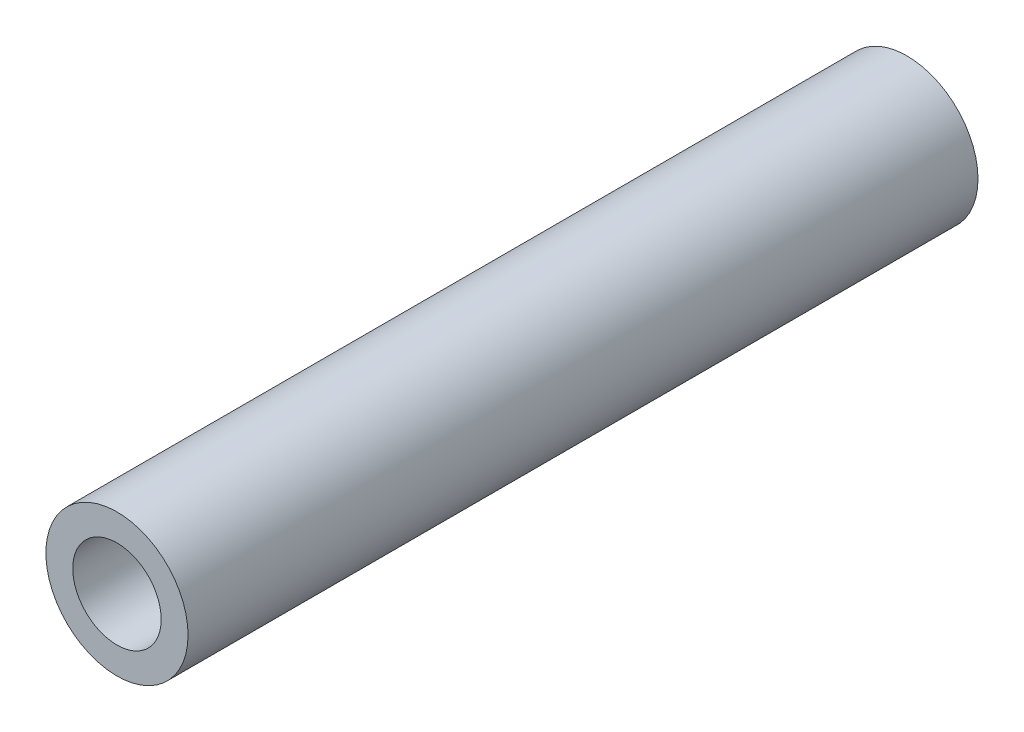
ISO-10303-21;
HEADER;
FILE_DESCRIPTION(('STEP AP214'),'2;1');
FILE_NAME('part.step','',(''),(''),'','','');
FILE_SCHEMA(('AUTOMOTIVE_DESIGN { 1 0 10303 214 1 1 1 1 }'));
ENDSEC;
DATA;
#1=APPLICATION_CONTEXT('core data for automotive mechanical design processes');
#2=APPLICATION_PROTOCOL_DEFINITION('international standard','automotive_design',2000,#1);
#3=PRODUCT_CONTEXT('',#1,'mechanical');
#4=PRODUCT('Part','Part','',(#3));
#5=PRODUCT_RELATED_PRODUCT_CATEGORY('part','',(#4));
#6=PRODUCT_DEFINITION_FORMATION('','',#4);
#7=PRODUCT_DEFINITION_CONTEXT('part definition',#1,'design');
#8=PRODUCT_DEFINITION('design','',#6,#7);
#9=PRODUCT_DEFINITION_SHAPE('','',#8);
#10=(LENGTH_UNIT() NAMED_UNIT(*) SI_UNIT(.MILLI.,.METRE.));
#11=(NAMED_UNIT(*) PLANE_ANGLE_UNIT() SI_UNIT($,.RADIAN.));
#12=(NAMED_UNIT(*) SI_UNIT($,.STERADIAN.) SOLID_ANGLE_UNIT());
#13=UNCERTAINTY_MEASURE_WITH_UNIT(LENGTH_MEASURE(1.E-05),#10,'distance_accuracy_value','');
#14=(GEOMETRIC_REPRESENTATION_CONTEXT(3) GLOBAL_UNCERTAINTY_ASSIGNED_CONTEXT((#13)) GLOBAL_UNIT_ASSIGNED_CONTEXT((#10,
#11,#12)) REPRESENTATION_CONTEXT('',''));
#15=CARTESIAN_POINT('',(0.,0.,0.));
#16=DIRECTION('',(0.,0.,1.));
#17=DIRECTION('',(1.,0.,0.));
#18=AXIS2_PLACEMENT_3D('',#15,#16,#17);
#19=CARTESIAN_POINT('',(0.,0.,20.));
#20=DIRECTION('',(0.,0.,1.));
#21=DIRECTION('',(1.,0.,0.));
#22=AXIS2_PLACEMENT_3D('',#19,#20,#21);
#23=PLANE('',#22);
#24=CARTESIAN_POINT('',(0.,0.,20.));
#25=DIRECTION('',(0.,0.,1.));
#26=DIRECTION('',(1.,0.,0.));
#27=AXIS2_PLACEMENT_3D('',#24,#25,#26);
#28=CIRCLE('',#27,1.8);
#29=CARTESIAN_POINT('',(1.8,0.,20.));
#30=VERTEX_POINT('',#29);
#31=EDGE_CURVE('E10',#30,#30,#28,.T.);
#32=ORIENTED_EDGE('',*,*,#31,.T.);
#33=EDGE_LOOP('',(#32));
#34=FACE_BOUND('',#33,.T.);
#35=CARTESIAN_POINT('',(0.,0.,20.));
#36=DIRECTION('',(0.,0.,1.));
#37=DIRECTION('',(1.,0.,0.));
#38=AXIS2_PLACEMENT_3D('',#35,#36,#37);
#39=CIRCLE('',#38,1.12);
#40=CARTESIAN_POINT('',(1.12,0.,20.));
#41=VERTEX_POINT('',#40);
#42=EDGE_CURVE('E52',#41,#41,#39,.T.);
#43=ORIENTED_EDGE('',*,*,#42,.F.);
#44=EDGE_LOOP('',(#43));
#45=FACE_BOUND('',#44,.T.);
#46=ADVANCED_FACE('F41',(#34,#45),#23,.T.);
#47=CARTESIAN_POINT('',(0.,0.,0.));
#48=DIRECTION('',(0.,0.,1.));
#49=DIRECTION('',(1.,0.,0.));
#50=AXIS2_PLACEMENT_3D('',#47,#48,#49);
#51=PLANE('',#50);
#52=CARTESIAN_POINT('',(0.,0.,0.));
#53=DIRECTION('',(0.,0.,1.));
#54=DIRECTION('',(1.,0.,0.));
#55=AXIS2_PLACEMENT_3D('',#52,#53,#54);
#56=CIRCLE('',#55,1.8);
#57=CARTESIAN_POINT('',(1.8,0.,0.));
#58=VERTEX_POINT('',#57);
#59=EDGE_CURVE('E45',#58,#58,#56,.T.);
#60=ORIENTED_EDGE('',*,*,#59,.F.);
#61=EDGE_LOOP('',(#60));
#62=FACE_BOUND('',#61,.T.);
#63=CARTESIAN_POINT('',(0.,0.,0.));
#64=DIRECTION('',(0.,0.,1.));
#65=DIRECTION('',(1.,0.,0.));
#66=AXIS2_PLACEMENT_3D('',#63,#64,#65);
#67=CIRCLE('',#66,1.12);
#68=CARTESIAN_POINT('',(1.12,0.,0.));
#69=VERTEX_POINT('',#68);
#70=EDGE_CURVE('E54',#69,#69,#67,.T.);
#71=ORIENTED_EDGE('',*,*,#70,.T.);
#72=EDGE_LOOP('',(#71));
#73=FACE_BOUND('',#72,.T.);
#74=ADVANCED_FACE('F64',(#62,#73),#51,.F.);
#75=CARTESIAN_POINT('',(0.,0.,20.));
#76=DIRECTION('',(0.,0.,-1.));
#77=DIRECTION('',(-1.,0.,0.));
#78=AXIS2_PLACEMENT_3D('',#75,#76,#77);
#79=CYLINDRICAL_SURFACE('',#78,1.8);
#80=ORIENTED_EDGE('',*,*,#31,.F.);
#81=EDGE_LOOP('',(#80));
#82=FACE_BOUND('',#81,.T.);
#83=ORIENTED_EDGE('',*,*,#59,.T.);
#84=EDGE_LOOP('',(#83));
#85=FACE_BOUND('',#84,.T.);
#86=ADVANCED_FACE('F43',(#82,#85),#79,.T.);
#87=CARTESIAN_POINT('',(0.,0.,20.));
#88=DIRECTION('',(0.,0.,-1.));
#89=DIRECTION('',(-1.,0.,0.));
#90=AXIS2_PLACEMENT_3D('',#87,#88,#89);
#91=CYLINDRICAL_SURFACE('',#90,1.12);
#92=ORIENTED_EDGE('',*,*,#42,.T.);
#93=EDGE_LOOP('',(#92));
#94=FACE_BOUND('',#93,.T.);
#95=ORIENTED_EDGE('',*,*,#70,.F.);
#96=EDGE_LOOP('',(#95));
#97=FACE_BOUND('',#96,.T.);
#98=ADVANCED_FACE('F60',(#94,#97),#91,.F.);
#99=CLOSED_SHELL('',(#46,#74,#86,#98));
#100=MANIFOLD_SOLID_BREP('B2',#99);
#101=ADVANCED_BREP_SHAPE_REPRESENTATION('',(#18,#100),#14);
#102=SHAPE_DEFINITION_REPRESENTATION(#9,#101);
ENDSEC;
END-ISO-10303-21;
